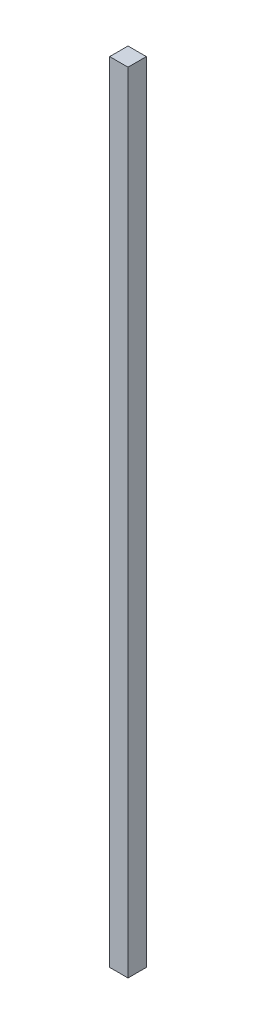
ISO-10303-21;
HEADER;
FILE_DESCRIPTION(('STEP AP214'),'2;1');
FILE_NAME('part.step','',(''),(''),'','','');
FILE_SCHEMA(('AUTOMOTIVE_DESIGN { 1 0 10303 214 1 1 1 1 }'));
ENDSEC;
DATA;
#1=APPLICATION_CONTEXT('core data for automotive mechanical design processes');
#2=APPLICATION_PROTOCOL_DEFINITION('international standard','automotive_design',2000,#1);
#3=PRODUCT_CONTEXT('',#1,'mechanical');
#4=PRODUCT('Part','Part','',(#3));
#5=PRODUCT_RELATED_PRODUCT_CATEGORY('part','',(#4));
#6=PRODUCT_DEFINITION_FORMATION('','',#4);
#7=PRODUCT_DEFINITION_CONTEXT('part definition',#1,'design');
#8=PRODUCT_DEFINITION('design','',#6,#7);
#9=PRODUCT_DEFINITION_SHAPE('','',#8);
#10=(LENGTH_UNIT() NAMED_UNIT(*) SI_UNIT(.MILLI.,.METRE.));
#11=(NAMED_UNIT(*) PLANE_ANGLE_UNIT() SI_UNIT($,.RADIAN.));
#12=(NAMED_UNIT(*) SI_UNIT($,.STERADIAN.) SOLID_ANGLE_UNIT());
#13=UNCERTAINTY_MEASURE_WITH_UNIT(LENGTH_MEASURE(1.E-05),#10,'distance_accuracy_value','');
#14=(GEOMETRIC_REPRESENTATION_CONTEXT(3) GLOBAL_UNCERTAINTY_ASSIGNED_CONTEXT((#13)) GLOBAL_UNIT_ASSIGNED_CONTEXT((#10,
#11,#12)) REPRESENTATION_CONTEXT('',''));
#15=CARTESIAN_POINT('',(0.,0.,0.));
#16=DIRECTION('',(0.,0.,1.));
#17=DIRECTION('',(1.,0.,0.));
#18=AXIS2_PLACEMENT_3D('',#15,#16,#17);
#19=CARTESIAN_POINT('',(10.,860.,-10.));
#20=DIRECTION('',(-1.,0.,0.));
#21=DIRECTION('',(0.,0.,1.));
#22=AXIS2_PLACEMENT_3D('',#19,#20,#21);
#23=PLANE('',#22);
#24=DIRECTION('',(0.,0.,-1.));
#25=VECTOR('',#24,1.);
#26=CARTESIAN_POINT('',(10.,0.,-10.));
#27=LINE('',#26,#25);
#28=CARTESIAN_POINT('',(10.,0.,9.99999999999999));
#29=VERTEX_POINT('',#28);
#30=CARTESIAN_POINT('',(10.,0.,-10.));
#31=VERTEX_POINT('',#30);
#32=EDGE_CURVE('E96',#29,#31,#27,.T.);
#33=ORIENTED_EDGE('',*,*,#32,.T.);
#34=DIRECTION('',(0.,-1.,0.));
#35=VECTOR('',#34,1.);
#36=CARTESIAN_POINT('',(10.,860.,-10.));
#37=LINE('',#36,#35);
#38=CARTESIAN_POINT('',(10.,860.,-10.));
#39=VERTEX_POINT('',#38);
#40=EDGE_CURVE('E11',#39,#31,#37,.T.);
#41=ORIENTED_EDGE('',*,*,#40,.F.);
#42=DIRECTION('',(0.,0.,-1.));
#43=VECTOR('',#42,1.);
#44=CARTESIAN_POINT('',(10.,860.,-10.));
#45=LINE('',#44,#43);
#46=CARTESIAN_POINT('',(10.,860.,9.99999999999999));
#47=VERTEX_POINT('',#46);
#48=EDGE_CURVE('E84',#47,#39,#45,.T.);
#49=ORIENTED_EDGE('',*,*,#48,.F.);
#50=DIRECTION('',(0.,-1.,0.));
#51=VECTOR('',#50,1.);
#52=CARTESIAN_POINT('',(10.,860.,9.99999999999999));
#53=LINE('',#52,#51);
#54=EDGE_CURVE('E92',#47,#29,#53,.T.);
#55=ORIENTED_EDGE('',*,*,#54,.T.);
#56=EDGE_LOOP('',(#33,#41,#49,#55));
#57=FACE_BOUND('',#56,.T.);
#58=ADVANCED_FACE('F33',(#57),#23,.F.);
#59=CARTESIAN_POINT('',(-10.,860.,-10.));
#60=DIRECTION('',(0.,0.,1.));
#61=DIRECTION('',(1.,0.,0.));
#62=AXIS2_PLACEMENT_3D('',#59,#60,#61);
#63=PLANE('',#62);
#64=DIRECTION('',(-1.,0.,0.));
#65=VECTOR('',#64,1.);
#66=CARTESIAN_POINT('',(-10.,0.,-10.));
#67=LINE('',#66,#65);
#68=CARTESIAN_POINT('',(-10.,0.,-10.));
#69=VERTEX_POINT('',#68);
#70=EDGE_CURVE('E88',#31,#69,#67,.T.);
#71=ORIENTED_EDGE('',*,*,#70,.T.);
#72=DIRECTION('',(0.,-1.,0.));
#73=VECTOR('',#72,1.);
#74=CARTESIAN_POINT('',(-10.,860.,-10.));
#75=LINE('',#74,#73);
#76=CARTESIAN_POINT('',(-10.,860.,-10.));
#77=VERTEX_POINT('',#76);
#78=EDGE_CURVE('E41',#77,#69,#75,.T.);
#79=ORIENTED_EDGE('',*,*,#78,.F.);
#80=DIRECTION('',(-1.,0.,0.));
#81=VECTOR('',#80,1.);
#82=CARTESIAN_POINT('',(-10.,860.,-10.));
#83=LINE('',#82,#81);
#84=EDGE_CURVE('E79',#39,#77,#83,.T.);
#85=ORIENTED_EDGE('',*,*,#84,.F.);
#86=ORIENTED_EDGE('',*,*,#40,.T.);
#87=EDGE_LOOP('',(#71,#79,#85,#86));
#88=FACE_BOUND('',#87,.T.);
#89=ADVANCED_FACE('F87',(#88),#63,.F.);
#90=CARTESIAN_POINT('',(-10.,860.,-10.));
#91=DIRECTION('',(1.,0.,0.));
#92=DIRECTION('',(0.,0.,-1.));
#93=AXIS2_PLACEMENT_3D('',#90,#91,#92);
#94=PLANE('',#93);
#95=DIRECTION('',(0.,0.,1.));
#96=VECTOR('',#95,1.);
#97=CARTESIAN_POINT('',(-10.,0.,-10.));
#98=LINE('',#97,#96);
#99=CARTESIAN_POINT('',(-10.,0.,9.99999999999999));
#100=VERTEX_POINT('',#99);
#101=EDGE_CURVE('E66',#69,#100,#98,.T.);
#102=ORIENTED_EDGE('',*,*,#101,.T.);
#103=DIRECTION('',(0.,-1.,0.));
#104=VECTOR('',#103,1.);
#105=CARTESIAN_POINT('',(-10.,860.,9.99999999999999));
#106=LINE('',#105,#104);
#107=CARTESIAN_POINT('',(-10.,860.,9.99999999999999));
#108=VERTEX_POINT('',#107);
#109=EDGE_CURVE('E89',#108,#100,#106,.T.);
#110=ORIENTED_EDGE('',*,*,#109,.F.);
#111=DIRECTION('',(0.,0.,1.));
#112=VECTOR('',#111,1.);
#113=CARTESIAN_POINT('',(-10.,860.,-10.));
#114=LINE('',#113,#112);
#115=EDGE_CURVE('E82',#77,#108,#114,.T.);
#116=ORIENTED_EDGE('',*,*,#115,.F.);
#117=ORIENTED_EDGE('',*,*,#78,.T.);
#118=EDGE_LOOP('',(#102,#110,#116,#117));
#119=FACE_BOUND('',#118,.T.);
#120=ADVANCED_FACE('F90',(#119),#94,.F.);
#121=CARTESIAN_POINT('',(-10.,860.,9.99999999999999));
#122=DIRECTION('',(0.,0.,-1.));
#123=DIRECTION('',(-1.,0.,0.));
#124=AXIS2_PLACEMENT_3D('',#121,#122,#123);
#125=PLANE('',#124);
#126=DIRECTION('',(1.,0.,0.));
#127=VECTOR('',#126,1.);
#128=CARTESIAN_POINT('',(-10.,0.,9.99999999999999));
#129=LINE('',#128,#127);
#130=EDGE_CURVE('E72',#100,#29,#129,.T.);
#131=ORIENTED_EDGE('',*,*,#130,.T.);
#132=ORIENTED_EDGE('',*,*,#54,.F.);
#133=DIRECTION('',(1.,0.,0.));
#134=VECTOR('',#133,1.);
#135=CARTESIAN_POINT('',(-10.,860.,9.99999999999999));
#136=LINE('',#135,#134);
#137=EDGE_CURVE('E49',#108,#47,#136,.T.);
#138=ORIENTED_EDGE('',*,*,#137,.F.);
#139=ORIENTED_EDGE('',*,*,#109,.T.);
#140=EDGE_LOOP('',(#131,#132,#138,#139));
#141=FACE_BOUND('',#140,.T.);
#142=ADVANCED_FACE('F103',(#141),#125,.F.);
#143=CARTESIAN_POINT('',(0.,860.,0.));
#144=DIRECTION('',(0.,1.,0.));
#145=DIRECTION('',(0.,0.,1.));
#146=AXIS2_PLACEMENT_3D('',#143,#144,#145);
#147=PLANE('',#146);
#148=ORIENTED_EDGE('',*,*,#48,.T.);
#149=ORIENTED_EDGE('',*,*,#84,.T.);
#150=ORIENTED_EDGE('',*,*,#115,.T.);
#151=ORIENTED_EDGE('',*,*,#137,.T.);
#152=EDGE_LOOP('',(#148,#149,#150,#151));
#153=FACE_BOUND('',#152,.T.);
#154=ADVANCED_FACE('F80',(#153),#147,.T.);
#155=CARTESIAN_POINT('',(0.,0.,0.));
#156=DIRECTION('',(0.,1.,0.));
#157=DIRECTION('',(0.,0.,1.));
#158=AXIS2_PLACEMENT_3D('',#155,#156,#157);
#159=PLANE('',#158);
#160=ORIENTED_EDGE('',*,*,#32,.F.);
#161=ORIENTED_EDGE('',*,*,#130,.F.);
#162=ORIENTED_EDGE('',*,*,#101,.F.);
#163=ORIENTED_EDGE('',*,*,#70,.F.);
#164=EDGE_LOOP('',(#160,#161,#162,#163));
#165=FACE_BOUND('',#164,.T.);
#166=ADVANCED_FACE('F106',(#165),#159,.F.);
#167=CLOSED_SHELL('',(#58,#89,#120,#142,#154,#166));
#168=MANIFOLD_SOLID_BREP('B2',#167);
#169=ADVANCED_BREP_SHAPE_REPRESENTATION('',(#18,#168),#14);
#170=SHAPE_DEFINITION_REPRESENTATION(#9,#169);
ENDSEC;
END-ISO-10303-21;
